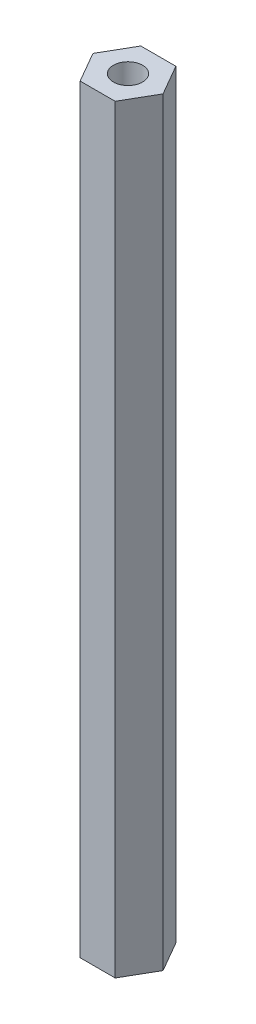
ISO-10303-21;
HEADER;
FILE_DESCRIPTION(('STEP AP214'),'2;1');
FILE_NAME('part.step','',(''),(''),'','','');
FILE_SCHEMA(('AUTOMOTIVE_DESIGN { 1 0 10303 214 1 1 1 1 }'));
ENDSEC;
DATA;
#1=APPLICATION_CONTEXT('core data for automotive mechanical design processes');
#2=APPLICATION_PROTOCOL_DEFINITION('international standard','automotive_design',2000,#1);
#3=PRODUCT_CONTEXT('',#1,'mechanical');
#4=PRODUCT('Part','Part','',(#3));
#5=PRODUCT_RELATED_PRODUCT_CATEGORY('part','',(#4));
#6=PRODUCT_DEFINITION_FORMATION('','',#4);
#7=PRODUCT_DEFINITION_CONTEXT('part definition',#1,'design');
#8=PRODUCT_DEFINITION('design','',#6,#7);
#9=PRODUCT_DEFINITION_SHAPE('','',#8);
#10=(LENGTH_UNIT() NAMED_UNIT(*) SI_UNIT(.MILLI.,.METRE.));
#11=(NAMED_UNIT(*) PLANE_ANGLE_UNIT() SI_UNIT($,.RADIAN.));
#12=(NAMED_UNIT(*) SI_UNIT($,.STERADIAN.) SOLID_ANGLE_UNIT());
#13=UNCERTAINTY_MEASURE_WITH_UNIT(LENGTH_MEASURE(1.E-05),#10,'distance_accuracy_value','');
#14=(GEOMETRIC_REPRESENTATION_CONTEXT(3) GLOBAL_UNCERTAINTY_ASSIGNED_CONTEXT((#13)) GLOBAL_UNIT_ASSIGNED_CONTEXT((#10,
#11,#12)) REPRESENTATION_CONTEXT('',''));
#15=CARTESIAN_POINT('',(0.,0.,0.));
#16=DIRECTION('',(0.,0.,1.));
#17=DIRECTION('',(1.,0.,0.));
#18=AXIS2_PLACEMENT_3D('',#15,#16,#17);
#19=CARTESIAN_POINT('',(3.,65.,0.));
#20=DIRECTION('',(-0.866025403784438,0.,0.5));
#21=DIRECTION('',(0.5,0.,0.866025403784439));
#22=AXIS2_PLACEMENT_3D('',#19,#20,#21);
#23=PLANE('',#22);
#24=DIRECTION('',(-0.5,0.,-0.866025403784439));
#25=VECTOR('',#24,1.);
#26=CARTESIAN_POINT('',(3.,0.,0.));
#27=LINE('',#26,#25);
#28=CARTESIAN_POINT('',(3.,0.,0.));
#29=VERTEX_POINT('',#28);
#30=CARTESIAN_POINT('',(1.5,0.,-2.59807621135332));
#31=VERTEX_POINT('',#30);
#32=EDGE_CURVE('E121',#29,#31,#27,.T.);
#33=ORIENTED_EDGE('',*,*,#32,.T.);
#34=DIRECTION('',(0.,-1.,0.));
#35=VECTOR('',#34,1.);
#36=CARTESIAN_POINT('',(1.5,65.,-2.59807621135332));
#37=LINE('',#36,#35);
#38=CARTESIAN_POINT('',(1.5,65.,-2.59807621135332));
#39=VERTEX_POINT('',#38);
#40=EDGE_CURVE('E11',#39,#31,#37,.T.);
#41=ORIENTED_EDGE('',*,*,#40,.F.);
#42=DIRECTION('',(-0.5,0.,-0.866025403784439));
#43=VECTOR('',#42,1.);
#44=CARTESIAN_POINT('',(3.,65.,0.));
#45=LINE('',#44,#43);
#46=CARTESIAN_POINT('',(3.,65.,0.));
#47=VERTEX_POINT('',#46);
#48=EDGE_CURVE('E132',#47,#39,#45,.T.);
#49=ORIENTED_EDGE('',*,*,#48,.F.);
#50=DIRECTION('',(0.,-1.,0.));
#51=VECTOR('',#50,1.);
#52=CARTESIAN_POINT('',(3.,65.,0.));
#53=LINE('',#52,#51);
#54=EDGE_CURVE('E117',#47,#29,#53,.T.);
#55=ORIENTED_EDGE('',*,*,#54,.T.);
#56=EDGE_LOOP('',(#33,#41,#49,#55));
#57=FACE_BOUND('',#56,.T.);
#58=ADVANCED_FACE('F37',(#57),#23,.F.);
#59=CARTESIAN_POINT('',(1.5,65.,-2.59807621135332));
#60=DIRECTION('',(0.,0.,1.));
#61=DIRECTION('',(1.,0.,0.));
#62=AXIS2_PLACEMENT_3D('',#59,#60,#61);
#63=PLANE('',#62);
#64=DIRECTION('',(-1.,0.,0.));
#65=VECTOR('',#64,1.);
#66=CARTESIAN_POINT('',(1.5,0.,-2.59807621135332));
#67=LINE('',#66,#65);
#68=CARTESIAN_POINT('',(-1.5,0.,-2.59807621135332));
#69=VERTEX_POINT('',#68);
#70=EDGE_CURVE('E124',#31,#69,#67,.T.);
#71=ORIENTED_EDGE('',*,*,#70,.T.);
#72=DIRECTION('',(0.,-1.,0.));
#73=VECTOR('',#72,1.);
#74=CARTESIAN_POINT('',(-1.5,65.,-2.59807621135332));
#75=LINE('',#74,#73);
#76=CARTESIAN_POINT('',(-1.5,65.,-2.59807621135332));
#77=VERTEX_POINT('',#76);
#78=EDGE_CURVE('E45',#77,#69,#75,.T.);
#79=ORIENTED_EDGE('',*,*,#78,.F.);
#80=DIRECTION('',(-1.,0.,0.));
#81=VECTOR('',#80,1.);
#82=CARTESIAN_POINT('',(1.5,65.,-2.59807621135332));
#83=LINE('',#82,#81);
#84=EDGE_CURVE('E90',#39,#77,#83,.T.);
#85=ORIENTED_EDGE('',*,*,#84,.F.);
#86=ORIENTED_EDGE('',*,*,#40,.T.);
#87=EDGE_LOOP('',(#71,#79,#85,#86));
#88=FACE_BOUND('',#87,.T.);
#89=ADVANCED_FACE('F157',(#88),#63,.F.);
#90=CARTESIAN_POINT('',(-1.5,65.,-2.59807621135332));
#91=DIRECTION('',(0.866025403784439,0.,0.5));
#92=DIRECTION('',(0.5,0.,-0.866025403784439));
#93=AXIS2_PLACEMENT_3D('',#90,#91,#92);
#94=PLANE('',#93);
#95=DIRECTION('',(-0.5,0.,0.866025403784439));
#96=VECTOR('',#95,1.);
#97=CARTESIAN_POINT('',(-1.5,0.,-2.59807621135332));
#98=LINE('',#97,#96);
#99=CARTESIAN_POINT('',(-3.,0.,0.));
#100=VERTEX_POINT('',#99);
#101=EDGE_CURVE('E127',#69,#100,#98,.T.);
#102=ORIENTED_EDGE('',*,*,#101,.T.);
#103=DIRECTION('',(0.,-1.,0.));
#104=VECTOR('',#103,1.);
#105=CARTESIAN_POINT('',(-3.,65.,0.));
#106=LINE('',#105,#104);
#107=CARTESIAN_POINT('',(-3.,65.,0.));
#108=VERTEX_POINT('',#107);
#109=EDGE_CURVE('E112',#108,#100,#106,.T.);
#110=ORIENTED_EDGE('',*,*,#109,.F.);
#111=DIRECTION('',(-0.5,0.,0.866025403784439));
#112=VECTOR('',#111,1.);
#113=CARTESIAN_POINT('',(-1.5,65.,-2.59807621135332));
#114=LINE('',#113,#112);
#115=EDGE_CURVE('E103',#77,#108,#114,.T.);
#116=ORIENTED_EDGE('',*,*,#115,.F.);
#117=ORIENTED_EDGE('',*,*,#78,.T.);
#118=EDGE_LOOP('',(#102,#110,#116,#117));
#119=FACE_BOUND('',#118,.T.);
#120=ADVANCED_FACE('F138',(#119),#94,.F.);
#121=CARTESIAN_POINT('',(-3.,65.,0.));
#122=DIRECTION('',(0.866025403784438,0.,-0.5));
#123=DIRECTION('',(-0.5,0.,-0.866025403784439));
#124=AXIS2_PLACEMENT_3D('',#121,#122,#123);
#125=PLANE('',#124);
#126=DIRECTION('',(0.5,0.,0.866025403784439));
#127=VECTOR('',#126,1.);
#128=CARTESIAN_POINT('',(-3.,0.,0.));
#129=LINE('',#128,#127);
#130=CARTESIAN_POINT('',(-1.5,0.,2.59807621135332));
#131=VERTEX_POINT('',#130);
#132=EDGE_CURVE('E111',#100,#131,#129,.T.);
#133=ORIENTED_EDGE('',*,*,#132,.T.);
#134=DIRECTION('',(0.,-1.,0.));
#135=VECTOR('',#134,1.);
#136=CARTESIAN_POINT('',(-1.5,65.,2.59807621135332));
#137=LINE('',#136,#135);
#138=CARTESIAN_POINT('',(-1.5,65.,2.59807621135332));
#139=VERTEX_POINT('',#138);
#140=EDGE_CURVE('E108',#139,#131,#137,.T.);
#141=ORIENTED_EDGE('',*,*,#140,.F.);
#142=DIRECTION('',(0.5,0.,0.866025403784439));
#143=VECTOR('',#142,1.);
#144=CARTESIAN_POINT('',(-3.,65.,0.));
#145=LINE('',#144,#143);
#146=EDGE_CURVE('E97',#108,#139,#145,.T.);
#147=ORIENTED_EDGE('',*,*,#146,.F.);
#148=ORIENTED_EDGE('',*,*,#109,.T.);
#149=EDGE_LOOP('',(#133,#141,#147,#148));
#150=FACE_BOUND('',#149,.T.);
#151=ADVANCED_FACE('F109',(#150),#125,.F.);
#152=CARTESIAN_POINT('',(-1.5,65.,2.59807621135332));
#153=DIRECTION('',(0.,0.,-1.));
#154=DIRECTION('',(-1.,0.,0.));
#155=AXIS2_PLACEMENT_3D('',#152,#153,#154);
#156=PLANE('',#155);
#157=DIRECTION('',(1.,0.,0.));
#158=VECTOR('',#157,1.);
#159=CARTESIAN_POINT('',(-1.5,0.,2.59807621135332));
#160=LINE('',#159,#158);
#161=CARTESIAN_POINT('',(1.5,0.,2.59807621135332));
#162=VERTEX_POINT('',#161);
#163=EDGE_CURVE('E76',#131,#162,#160,.T.);
#164=ORIENTED_EDGE('',*,*,#163,.T.);
#165=DIRECTION('',(0.,-1.,0.));
#166=VECTOR('',#165,1.);
#167=CARTESIAN_POINT('',(1.5,65.,2.59807621135332));
#168=LINE('',#167,#166);
#169=CARTESIAN_POINT('',(1.5,65.,2.59807621135332));
#170=VERTEX_POINT('',#169);
#171=EDGE_CURVE('E113',#170,#162,#168,.T.);
#172=ORIENTED_EDGE('',*,*,#171,.F.);
#173=DIRECTION('',(1.,0.,0.));
#174=VECTOR('',#173,1.);
#175=CARTESIAN_POINT('',(-1.5,65.,2.59807621135332));
#176=LINE('',#175,#174);
#177=EDGE_CURVE('E101',#139,#170,#176,.T.);
#178=ORIENTED_EDGE('',*,*,#177,.F.);
#179=ORIENTED_EDGE('',*,*,#140,.T.);
#180=EDGE_LOOP('',(#164,#172,#178,#179));
#181=FACE_BOUND('',#180,.T.);
#182=ADVANCED_FACE('F115',(#181),#156,.F.);
#183=CARTESIAN_POINT('',(1.5,65.,2.59807621135332));
#184=DIRECTION('',(-0.866025403784439,0.,-0.5));
#185=DIRECTION('',(-0.5,0.,0.866025403784439));
#186=AXIS2_PLACEMENT_3D('',#183,#184,#185);
#187=PLANE('',#186);
#188=DIRECTION('',(0.5,0.,-0.866025403784439));
#189=VECTOR('',#188,1.);
#190=CARTESIAN_POINT('',(1.5,0.,2.59807621135332));
#191=LINE('',#190,#189);
#192=EDGE_CURVE('E82',#162,#29,#191,.T.);
#193=ORIENTED_EDGE('',*,*,#192,.T.);
#194=ORIENTED_EDGE('',*,*,#54,.F.);
#195=DIRECTION('',(0.5,0.,-0.866025403784439));
#196=VECTOR('',#195,1.);
#197=CARTESIAN_POINT('',(1.5,65.,2.59807621135332));
#198=LINE('',#197,#196);
#199=EDGE_CURVE('E53',#170,#47,#198,.T.);
#200=ORIENTED_EDGE('',*,*,#199,.F.);
#201=ORIENTED_EDGE('',*,*,#171,.T.);
#202=EDGE_LOOP('',(#193,#194,#200,#201));
#203=FACE_BOUND('',#202,.T.);
#204=ADVANCED_FACE('F145',(#203),#187,.F.);
#205=CARTESIAN_POINT('',(0.,65.,0.));
#206=DIRECTION('',(0.,1.,0.));
#207=DIRECTION('',(0.,0.,1.));
#208=AXIS2_PLACEMENT_3D('',#205,#206,#207);
#209=PLANE('',#208);
#210=CARTESIAN_POINT('',(0.,65.,0.));
#211=DIRECTION('',(0.,1.,0.));
#212=DIRECTION('',(0.,0.,1.));
#213=AXIS2_PLACEMENT_3D('',#210,#211,#212);
#214=CIRCLE('',#213,1.25);
#215=CARTESIAN_POINT('',(0.,65.,1.25));
#216=VERTEX_POINT('',#215);
#217=EDGE_CURVE('E214',#216,#216,#214,.T.);
#218=ORIENTED_EDGE('',*,*,#217,.F.);
#219=EDGE_LOOP('',(#218));
#220=FACE_BOUND('',#219,.T.);
#221=ORIENTED_EDGE('',*,*,#48,.T.);
#222=ORIENTED_EDGE('',*,*,#84,.T.);
#223=ORIENTED_EDGE('',*,*,#115,.T.);
#224=ORIENTED_EDGE('',*,*,#146,.T.);
#225=ORIENTED_EDGE('',*,*,#177,.T.);
#226=ORIENTED_EDGE('',*,*,#199,.T.);
#227=EDGE_LOOP('',(#221,#222,#223,#224,#225,#226));
#228=FACE_BOUND('',#227,.T.);
#229=ADVANCED_FACE('F99',(#220,#228),#209,.T.);
#230=CARTESIAN_POINT('',(0.,0.,0.));
#231=DIRECTION('',(0.,1.,0.));
#232=DIRECTION('',(0.,0.,1.));
#233=AXIS2_PLACEMENT_3D('',#230,#231,#232);
#234=PLANE('',#233);
#235=CARTESIAN_POINT('',(0.,0.,0.));
#236=DIRECTION('',(0.,1.,0.));
#237=DIRECTION('',(0.,0.,1.));
#238=AXIS2_PLACEMENT_3D('',#235,#236,#237);
#239=CIRCLE('',#238,1.24999999999999);
#240=CARTESIAN_POINT('',(0.,0.,1.24999999999999));
#241=VERTEX_POINT('',#240);
#242=EDGE_CURVE('E125',#241,#241,#239,.T.);
#243=ORIENTED_EDGE('',*,*,#242,.T.);
#244=EDGE_LOOP('',(#243));
#245=FACE_BOUND('',#244,.T.);
#246=ORIENTED_EDGE('',*,*,#32,.F.);
#247=ORIENTED_EDGE('',*,*,#192,.F.);
#248=ORIENTED_EDGE('',*,*,#163,.F.);
#249=ORIENTED_EDGE('',*,*,#132,.F.);
#250=ORIENTED_EDGE('',*,*,#101,.F.);
#251=ORIENTED_EDGE('',*,*,#70,.F.);
#252=EDGE_LOOP('',(#246,#247,#248,#249,#250,#251));
#253=FACE_BOUND('',#252,.T.);
#254=ADVANCED_FACE('F141',(#245,#253),#234,.F.);
#255=CARTESIAN_POINT('',(0.,65.,0.));
#256=DIRECTION('',(0.,1.,0.));
#257=DIRECTION('',(0.,0.,1.));
#258=AXIS2_PLACEMENT_3D('',#255,#256,#257);
#259=CYLINDRICAL_SURFACE('',#258,1.24999999999999);
#260=ORIENTED_EDGE('',*,*,#242,.F.);
#261=EDGE_LOOP('',(#260));
#262=FACE_BOUND('',#261,.T.);
#263=ORIENTED_EDGE('',*,*,#217,.T.);
#264=EDGE_LOOP('',(#263));
#265=FACE_BOUND('',#264,.T.);
#266=ADVANCED_FACE('F194',(#262,#265),#259,.F.);
#267=CLOSED_SHELL('',(#58,#89,#120,#151,#182,#204,#229,#254,#266));
#268=MANIFOLD_SOLID_BREP('B2',#267);
#269=ADVANCED_BREP_SHAPE_REPRESENTATION('',(#18,#268),#14);
#270=SHAPE_DEFINITION_REPRESENTATION(#9,#269);
ENDSEC;
END-ISO-10303-21;
